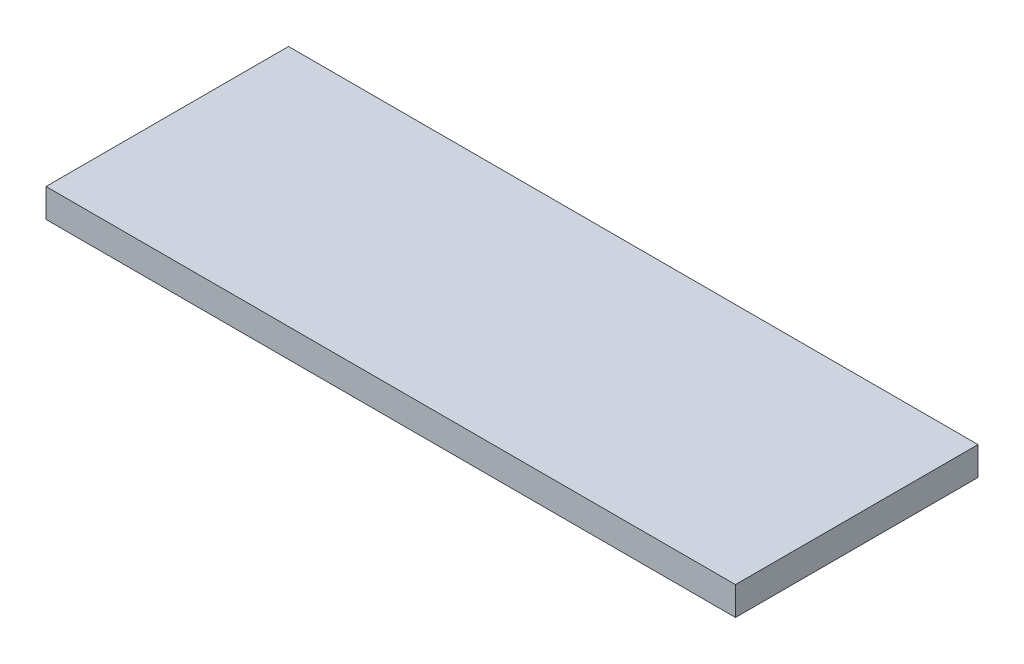
ISO-10303-21;
HEADER;
FILE_DESCRIPTION(('STEP AP214'),'2;1');
FILE_NAME('part.step','',(''),(''),'','','');
FILE_SCHEMA(('AUTOMOTIVE_DESIGN { 1 0 10303 214 1 1 1 1 }'));
ENDSEC;
DATA;
#1=APPLICATION_CONTEXT('core data for automotive mechanical design processes');
#2=APPLICATION_PROTOCOL_DEFINITION('international standard','automotive_design',2000,#1);
#3=PRODUCT_CONTEXT('',#1,'mechanical');
#4=PRODUCT('Part','Part','',(#3));
#5=PRODUCT_RELATED_PRODUCT_CATEGORY('part','',(#4));
#6=PRODUCT_DEFINITION_FORMATION('','',#4);
#7=PRODUCT_DEFINITION_CONTEXT('part definition',#1,'design');
#8=PRODUCT_DEFINITION('design','',#6,#7);
#9=PRODUCT_DEFINITION_SHAPE('','',#8);
#10=(LENGTH_UNIT() NAMED_UNIT(*) SI_UNIT(.MILLI.,.METRE.));
#11=(NAMED_UNIT(*) PLANE_ANGLE_UNIT() SI_UNIT($,.RADIAN.));
#12=(NAMED_UNIT(*) SI_UNIT($,.STERADIAN.) SOLID_ANGLE_UNIT());
#13=UNCERTAINTY_MEASURE_WITH_UNIT(LENGTH_MEASURE(1.E-05),#10,'distance_accuracy_value','');
#14=(GEOMETRIC_REPRESENTATION_CONTEXT(3) GLOBAL_UNCERTAINTY_ASSIGNED_CONTEXT((#13)) GLOBAL_UNIT_ASSIGNED_CONTEXT((#10,
#11,#12)) REPRESENTATION_CONTEXT('',''));
#15=CARTESIAN_POINT('',(0.,0.,0.));
#16=DIRECTION('',(0.,0.,1.));
#17=DIRECTION('',(1.,0.,0.));
#18=AXIS2_PLACEMENT_3D('',#15,#16,#17);
#19=CARTESIAN_POINT('',(0.,3.,0.));
#20=DIRECTION('',(1.,0.,0.));
#21=DIRECTION('',(0.,0.,-1.));
#22=AXIS2_PLACEMENT_3D('',#19,#20,#21);
#23=PLANE('',#22);
#24=DIRECTION('',(0.,0.,1.));
#25=VECTOR('',#24,1.);
#26=CARTESIAN_POINT('',(0.,0.,0.));
#27=LINE('',#26,#25);
#28=CARTESIAN_POINT('',(0.,0.,0.));
#29=VERTEX_POINT('',#28);
#30=CARTESIAN_POINT('',(0.,0.,25.5));
#31=VERTEX_POINT('',#30);
#32=EDGE_CURVE('E102',#29,#31,#27,.T.);
#33=ORIENTED_EDGE('',*,*,#32,.T.);
#34=DIRECTION('',(0.,-1.,0.));
#35=VECTOR('',#34,1.);
#36=CARTESIAN_POINT('',(0.,3.,25.5));
#37=LINE('',#36,#35);
#38=CARTESIAN_POINT('',(0.,3.,25.5));
#39=VERTEX_POINT('',#38);
#40=EDGE_CURVE('E11',#39,#31,#37,.T.);
#41=ORIENTED_EDGE('',*,*,#40,.F.);
#42=DIRECTION('',(0.,0.,1.));
#43=VECTOR('',#42,1.);
#44=CARTESIAN_POINT('',(0.,3.,0.));
#45=LINE('',#44,#43);
#46=CARTESIAN_POINT('',(0.,3.,0.));
#47=VERTEX_POINT('',#46);
#48=EDGE_CURVE('E90',#47,#39,#45,.T.);
#49=ORIENTED_EDGE('',*,*,#48,.F.);
#50=DIRECTION('',(0.,-1.,0.));
#51=VECTOR('',#50,1.);
#52=CARTESIAN_POINT('',(0.,3.,0.));
#53=LINE('',#52,#51);
#54=EDGE_CURVE('E98',#47,#29,#53,.T.);
#55=ORIENTED_EDGE('',*,*,#54,.T.);
#56=EDGE_LOOP('',(#33,#41,#49,#55));
#57=FACE_BOUND('',#56,.T.);
#58=ADVANCED_FACE('F39',(#57),#23,.F.);
#59=CARTESIAN_POINT('',(0.,3.,25.5));
#60=DIRECTION('',(0.,0.,-1.));
#61=DIRECTION('',(-1.,0.,0.));
#62=AXIS2_PLACEMENT_3D('',#59,#60,#61);
#63=PLANE('',#62);
#64=DIRECTION('',(1.,0.,0.));
#65=VECTOR('',#64,1.);
#66=CARTESIAN_POINT('',(0.,0.,25.5));
#67=LINE('',#66,#65);
#68=CARTESIAN_POINT('',(72.5,0.,25.5));
#69=VERTEX_POINT('',#68);
#70=EDGE_CURVE('E94',#31,#69,#67,.T.);
#71=ORIENTED_EDGE('',*,*,#70,.T.);
#72=DIRECTION('',(0.,-1.,0.));
#73=VECTOR('',#72,1.);
#74=CARTESIAN_POINT('',(72.5,3.,25.5));
#75=LINE('',#74,#73);
#76=CARTESIAN_POINT('',(72.5,3.,25.5));
#77=VERTEX_POINT('',#76);
#78=EDGE_CURVE('E47',#77,#69,#75,.T.);
#79=ORIENTED_EDGE('',*,*,#78,.F.);
#80=DIRECTION('',(1.,0.,0.));
#81=VECTOR('',#80,1.);
#82=CARTESIAN_POINT('',(0.,3.,25.5));
#83=LINE('',#82,#81);
#84=EDGE_CURVE('E85',#39,#77,#83,.T.);
#85=ORIENTED_EDGE('',*,*,#84,.F.);
#86=ORIENTED_EDGE('',*,*,#40,.T.);
#87=EDGE_LOOP('',(#71,#79,#85,#86));
#88=FACE_BOUND('',#87,.T.);
#89=ADVANCED_FACE('F93',(#88),#63,.F.);
#90=CARTESIAN_POINT('',(72.5,3.,0.));
#91=DIRECTION('',(-1.,0.,0.));
#92=DIRECTION('',(0.,0.,1.));
#93=AXIS2_PLACEMENT_3D('',#90,#91,#92);
#94=PLANE('',#93);
#95=DIRECTION('',(0.,0.,-1.));
#96=VECTOR('',#95,1.);
#97=CARTESIAN_POINT('',(72.5,0.,0.));
#98=LINE('',#97,#96);
#99=CARTESIAN_POINT('',(72.5,0.,0.));
#100=VERTEX_POINT('',#99);
#101=EDGE_CURVE('E72',#69,#100,#98,.T.);
#102=ORIENTED_EDGE('',*,*,#101,.T.);
#103=DIRECTION('',(0.,-1.,0.));
#104=VECTOR('',#103,1.);
#105=CARTESIAN_POINT('',(72.5,3.,0.));
#106=LINE('',#105,#104);
#107=CARTESIAN_POINT('',(72.5,3.,0.));
#108=VERTEX_POINT('',#107);
#109=EDGE_CURVE('E95',#108,#100,#106,.T.);
#110=ORIENTED_EDGE('',*,*,#109,.F.);
#111=DIRECTION('',(0.,0.,-1.));
#112=VECTOR('',#111,1.);
#113=CARTESIAN_POINT('',(72.5,3.,0.));
#114=LINE('',#113,#112);
#115=EDGE_CURVE('E88',#77,#108,#114,.T.);
#116=ORIENTED_EDGE('',*,*,#115,.F.);
#117=ORIENTED_EDGE('',*,*,#78,.T.);
#118=EDGE_LOOP('',(#102,#110,#116,#117));
#119=FACE_BOUND('',#118,.T.);
#120=ADVANCED_FACE('F96',(#119),#94,.F.);
#121=CARTESIAN_POINT('',(0.,3.,0.));
#122=DIRECTION('',(0.,0.,1.));
#123=DIRECTION('',(1.,0.,0.));
#124=AXIS2_PLACEMENT_3D('',#121,#122,#123);
#125=PLANE('',#124);
#126=DIRECTION('',(-1.,0.,0.));
#127=VECTOR('',#126,1.);
#128=CARTESIAN_POINT('',(0.,0.,0.));
#129=LINE('',#128,#127);
#130=EDGE_CURVE('E78',#100,#29,#129,.T.);
#131=ORIENTED_EDGE('',*,*,#130,.T.);
#132=ORIENTED_EDGE('',*,*,#54,.F.);
#133=DIRECTION('',(-1.,0.,0.));
#134=VECTOR('',#133,1.);
#135=CARTESIAN_POINT('',(0.,3.,0.));
#136=LINE('',#135,#134);
#137=EDGE_CURVE('E55',#108,#47,#136,.T.);
#138=ORIENTED_EDGE('',*,*,#137,.F.);
#139=ORIENTED_EDGE('',*,*,#109,.T.);
#140=EDGE_LOOP('',(#131,#132,#138,#139));
#141=FACE_BOUND('',#140,.T.);
#142=ADVANCED_FACE('F109',(#141),#125,.F.);
#143=CARTESIAN_POINT('',(0.,3.,0.));
#144=DIRECTION('',(0.,1.,0.));
#145=DIRECTION('',(0.,0.,1.));
#146=AXIS2_PLACEMENT_3D('',#143,#144,#145);
#147=PLANE('',#146);
#148=ORIENTED_EDGE('',*,*,#48,.T.);
#149=ORIENTED_EDGE('',*,*,#84,.T.);
#150=ORIENTED_EDGE('',*,*,#115,.T.);
#151=ORIENTED_EDGE('',*,*,#137,.T.);
#152=EDGE_LOOP('',(#148,#149,#150,#151));
#153=FACE_BOUND('',#152,.T.);
#154=ADVANCED_FACE('F86',(#153),#147,.T.);
#155=CARTESIAN_POINT('',(0.,0.,0.));
#156=DIRECTION('',(0.,1.,0.));
#157=DIRECTION('',(0.,0.,1.));
#158=AXIS2_PLACEMENT_3D('',#155,#156,#157);
#159=PLANE('',#158);
#160=ORIENTED_EDGE('',*,*,#32,.F.);
#161=ORIENTED_EDGE('',*,*,#130,.F.);
#162=ORIENTED_EDGE('',*,*,#101,.F.);
#163=ORIENTED_EDGE('',*,*,#70,.F.);
#164=EDGE_LOOP('',(#160,#161,#162,#163));
#165=FACE_BOUND('',#164,.T.);
#166=ADVANCED_FACE('F112',(#165),#159,.F.);
#167=CLOSED_SHELL('',(#58,#89,#120,#142,#154,#166));
#168=MANIFOLD_SOLID_BREP('B2',#167);
#169=ADVANCED_BREP_SHAPE_REPRESENTATION('',(#18,#168),#14);
#170=SHAPE_DEFINITION_REPRESENTATION(#9,#169);
ENDSEC;
END-ISO-10303-21;
